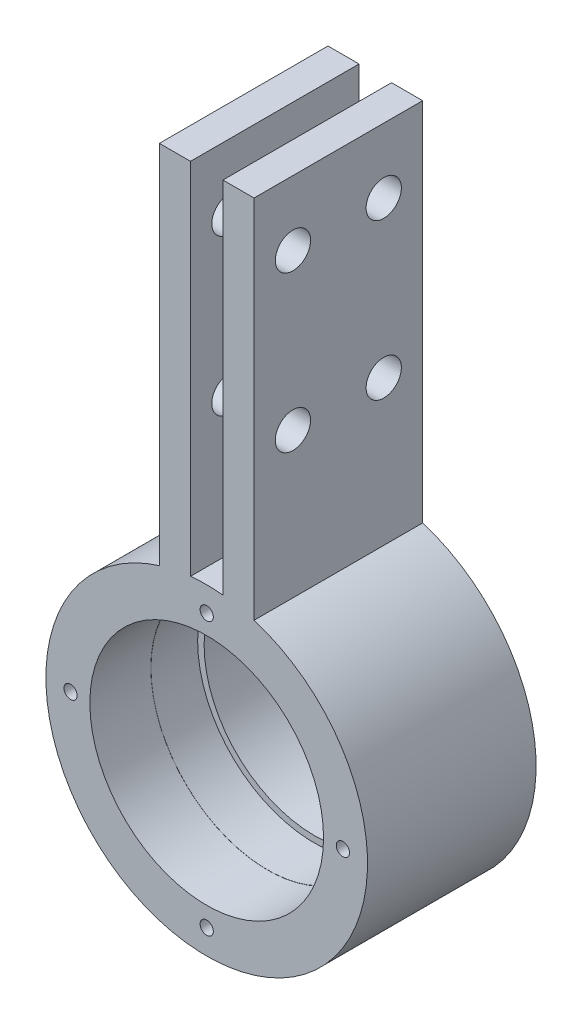
ISO-10303-21;
HEADER;
FILE_DESCRIPTION(('STEP AP214'),'2;1');
FILE_NAME('part.step','',(''),(''),'','','');
FILE_SCHEMA(('AUTOMOTIVE_DESIGN { 1 0 10303 214 1 1 1 1 }'));
ENDSEC;
DATA;
#1=APPLICATION_CONTEXT('core data for automotive mechanical design processes');
#2=APPLICATION_PROTOCOL_DEFINITION('international standard','automotive_design',2000,#1);
#3=PRODUCT_CONTEXT('',#1,'mechanical');
#4=PRODUCT('Part','Part','',(#3));
#5=PRODUCT_RELATED_PRODUCT_CATEGORY('part','',(#4));
#6=PRODUCT_DEFINITION_FORMATION('','',#4);
#7=PRODUCT_DEFINITION_CONTEXT('part definition',#1,'design');
#8=PRODUCT_DEFINITION('design','',#6,#7);
#9=PRODUCT_DEFINITION_SHAPE('','',#8);
#10=(LENGTH_UNIT() NAMED_UNIT(*) SI_UNIT(.MILLI.,.METRE.));
#11=(NAMED_UNIT(*) PLANE_ANGLE_UNIT() SI_UNIT($,.RADIAN.));
#12=(NAMED_UNIT(*) SI_UNIT($,.STERADIAN.) SOLID_ANGLE_UNIT());
#13=UNCERTAINTY_MEASURE_WITH_UNIT(LENGTH_MEASURE(1.E-05),#10,'distance_accuracy_value','');
#14=(GEOMETRIC_REPRESENTATION_CONTEXT(3) GLOBAL_UNCERTAINTY_ASSIGNED_CONTEXT((#13)) GLOBAL_UNIT_ASSIGNED_CONTEXT((#10,
#11,#12)) REPRESENTATION_CONTEXT('',''));
#15=CARTESIAN_POINT('',(0.,0.,0.));
#16=DIRECTION('',(0.,0.,1.));
#17=DIRECTION('',(1.,0.,0.));
#18=AXIS2_PLACEMENT_3D('',#15,#16,#17);
#19=CARTESIAN_POINT('',(0.,0.,65.));
#20=DIRECTION('',(0.,0.,-1.));
#21=DIRECTION('',(-1.,0.,0.));
#22=AXIS2_PLACEMENT_3D('',#19,#20,#21);
#23=CYLINDRICAL_SURFACE('',#22,42.5);
#24=CARTESIAN_POINT('',(0.,0.,0.));
#25=DIRECTION('',(0.,0.,1.));
#26=DIRECTION('',(1.,0.,0.));
#27=AXIS2_PLACEMENT_3D('',#24,#25,#26);
#28=CIRCLE('',#27,42.5);
#29=CARTESIAN_POINT('',(42.5,0.,0.));
#30=VERTEX_POINT('',#29);
#31=EDGE_CURVE('E151',#30,#30,#28,.T.);
#32=ORIENTED_EDGE('',*,*,#31,.F.);
#33=EDGE_LOOP('',(#32));
#34=FACE_BOUND('',#33,.T.);
#35=CARTESIAN_POINT('',(0.,0.,23.5));
#36=DIRECTION('',(0.,0.,1.));
#37=DIRECTION('',(1.,0.,0.));
#38=AXIS2_PLACEMENT_3D('',#35,#36,#37);
#39=CIRCLE('',#38,42.5);
#40=CARTESIAN_POINT('',(42.5,0.,23.5));
#41=VERTEX_POINT('',#40);
#42=EDGE_CURVE('E48',#41,#41,#39,.T.);
#43=ORIENTED_EDGE('',*,*,#42,.T.);
#44=EDGE_LOOP('',(#43));
#45=FACE_BOUND('',#44,.T.);
#46=ADVANCED_FACE('F45',(#34,#45),#23,.F.);
#47=CARTESIAN_POINT('',(6.25000000000002,0.,65.));
#48=DIRECTION('',(1.,0.,0.));
#49=DIRECTION('',(0.,1.,0.));
#50=AXIS2_PLACEMENT_3D('',#47,#48,#49);
#51=PLANE('',#50);
#52=CARTESIAN_POINT('',(6.24999999999999,175.253164472457,50.));
#53=DIRECTION('',(1.,0.,0.));
#54=DIRECTION('',(0.,1.,0.));
#55=AXIS2_PLACEMENT_3D('',#52,#53,#54);
#56=CIRCLE('',#55,6.8);
#57=CARTESIAN_POINT('',(6.24999999999999,182.053164472457,50.));
#58=VERTEX_POINT('',#57);
#59=EDGE_CURVE('E395',#58,#58,#56,.T.);
#60=ORIENTED_EDGE('',*,*,#59,.T.);
#61=EDGE_LOOP('',(#60));
#62=FACE_BOUND('',#61,.T.);
#63=CARTESIAN_POINT('',(6.24999999999999,175.253164472457,15.));
#64=DIRECTION('',(1.,0.,0.));
#65=DIRECTION('',(0.,1.,0.));
#66=AXIS2_PLACEMENT_3D('',#63,#64,#65);
#67=CIRCLE('',#66,6.8);
#68=CARTESIAN_POINT('',(6.24999999999999,182.053164472457,15.));
#69=VERTEX_POINT('',#68);
#70=EDGE_CURVE('E415',#69,#69,#67,.T.);
#71=ORIENTED_EDGE('',*,*,#70,.T.);
#72=EDGE_LOOP('',(#71));
#73=FACE_BOUND('',#72,.T.);
#74=CARTESIAN_POINT('',(6.25,115.253164472457,15.));
#75=DIRECTION('',(1.,0.,0.));
#76=DIRECTION('',(0.,1.,0.));
#77=AXIS2_PLACEMENT_3D('',#74,#75,#76);
#78=CIRCLE('',#77,6.79999999999999);
#79=CARTESIAN_POINT('',(6.25,122.053164472457,15.));
#80=VERTEX_POINT('',#79);
#81=EDGE_CURVE('E431',#80,#80,#78,.T.);
#82=ORIENTED_EDGE('',*,*,#81,.T.);
#83=EDGE_LOOP('',(#82));
#84=FACE_BOUND('',#83,.T.);
#85=CARTESIAN_POINT('',(6.25,115.253164472457,50.));
#86=DIRECTION('',(1.,0.,0.));
#87=DIRECTION('',(0.,1.,0.));
#88=AXIS2_PLACEMENT_3D('',#85,#86,#87);
#89=CIRCLE('',#88,6.79999999999999);
#90=CARTESIAN_POINT('',(6.25,122.053164472457,50.));
#91=VERTEX_POINT('',#90);
#92=EDGE_CURVE('E447',#91,#91,#89,.T.);
#93=ORIENTED_EDGE('',*,*,#92,.T.);
#94=EDGE_LOOP('',(#93));
#95=FACE_BOUND('',#94,.T.);
#96=DIRECTION('',(0.,-1.,0.));
#97=VECTOR('',#96,1.);
#98=CARTESIAN_POINT('',(6.25000000000002,0.,0.));
#99=LINE('',#98,#97);
#100=CARTESIAN_POINT('',(6.24999999999999,200.253164472457,0.));
#101=VERTEX_POINT('',#100);
#102=CARTESIAN_POINT('',(6.25000000000001,61.6841754423289,0.));
#103=VERTEX_POINT('',#102);
#104=EDGE_CURVE('E155',#101,#103,#99,.T.);
#105=ORIENTED_EDGE('',*,*,#104,.T.);
#106=DIRECTION('',(0.,0.,-1.));
#107=VECTOR('',#106,1.);
#108=CARTESIAN_POINT('',(6.25000000000001,61.6841754423289,65.));
#109=LINE('',#108,#107);
#110=CARTESIAN_POINT('',(6.25000000000001,61.6841754423289,65.));
#111=VERTEX_POINT('',#110);
#112=EDGE_CURVE('E11',#111,#103,#109,.T.);
#113=ORIENTED_EDGE('',*,*,#112,.F.);
#114=DIRECTION('',(0.,-1.,0.));
#115=VECTOR('',#114,1.);
#116=CARTESIAN_POINT('',(6.25000000000002,0.,65.));
#117=LINE('',#116,#115);
#118=CARTESIAN_POINT('',(6.24999999999999,200.253164472457,65.));
#119=VERTEX_POINT('',#118);
#120=EDGE_CURVE('E184',#119,#111,#117,.T.);
#121=ORIENTED_EDGE('',*,*,#120,.F.);
#122=DIRECTION('',(0.,0.,-1.));
#123=VECTOR('',#122,1.);
#124=CARTESIAN_POINT('',(6.24999999999999,200.253164472457,65.));
#125=LINE('',#124,#123);
#126=EDGE_CURVE('E63',#119,#101,#125,.T.);
#127=ORIENTED_EDGE('',*,*,#126,.T.);
#128=EDGE_LOOP('',(#105,#113,#121,#127));
#129=FACE_BOUND('',#128,.T.);
#130=ADVANCED_FACE('F237',(#62,#73,#84,#95,#129),#51,.F.);
#131=CARTESIAN_POINT('',(0.,0.,65.));
#132=DIRECTION('',(0.,0.,-1.));
#133=DIRECTION('',(-1.,0.,0.));
#134=AXIS2_PLACEMENT_3D('',#131,#132,#133);
#135=CYLINDRICAL_SURFACE('',#134,62.0000000000001);
#136=CARTESIAN_POINT('',(0.,0.,0.));
#137=DIRECTION('',(0.,0.,1.));
#138=DIRECTION('',(1.,0.,0.));
#139=AXIS2_PLACEMENT_3D('',#136,#137,#138);
#140=CIRCLE('',#139,62.0000000000001);
#141=CARTESIAN_POINT('',(-6.24999999999999,61.6841754423289,0.));
#142=VERTEX_POINT('',#141);
#143=EDGE_CURVE('E159',#103,#142,#140,.T.);
#144=ORIENTED_EDGE('',*,*,#143,.T.);
#145=DIRECTION('',(0.,0.,-1.));
#146=VECTOR('',#145,1.);
#147=CARTESIAN_POINT('',(-6.24999999999999,61.6841754423289,65.));
#148=LINE('',#147,#146);
#149=CARTESIAN_POINT('',(-6.24999999999999,61.6841754423289,65.));
#150=VERTEX_POINT('',#149);
#151=EDGE_CURVE('E55',#150,#142,#148,.T.);
#152=ORIENTED_EDGE('',*,*,#151,.F.);
#153=CARTESIAN_POINT('',(0.,0.,65.));
#154=DIRECTION('',(0.,0.,1.));
#155=DIRECTION('',(1.,0.,0.));
#156=AXIS2_PLACEMENT_3D('',#153,#154,#155);
#157=CIRCLE('',#156,62.0000000000001);
#158=EDGE_CURVE('E103',#111,#150,#157,.T.);
#159=ORIENTED_EDGE('',*,*,#158,.F.);
#160=ORIENTED_EDGE('',*,*,#112,.T.);
#161=EDGE_LOOP('',(#144,#152,#159,#160));
#162=FACE_BOUND('',#161,.T.);
#163=ADVANCED_FACE('F204',(#162),#135,.T.);
#164=CARTESIAN_POINT('',(-6.24999999999998,0.,65.));
#165=DIRECTION('',(1.,0.,0.));
#166=DIRECTION('',(0.,1.,0.));
#167=AXIS2_PLACEMENT_3D('',#164,#165,#166);
#168=PLANE('',#167);
#169=CARTESIAN_POINT('',(-6.25000000000001,175.253164472457,50.));
#170=DIRECTION('',(1.,0.,0.));
#171=DIRECTION('',(0.,1.,0.));
#172=AXIS2_PLACEMENT_3D('',#169,#170,#171);
#173=CIRCLE('',#172,6.8);
#174=CARTESIAN_POINT('',(-6.25000000000001,182.053164472457,50.));
#175=VERTEX_POINT('',#174);
#176=EDGE_CURVE('E388',#175,#175,#173,.T.);
#177=ORIENTED_EDGE('',*,*,#176,.F.);
#178=EDGE_LOOP('',(#177));
#179=FACE_BOUND('',#178,.T.);
#180=CARTESIAN_POINT('',(-6.25000000000001,175.253164472457,15.));
#181=DIRECTION('',(1.,0.,0.));
#182=DIRECTION('',(0.,1.,0.));
#183=AXIS2_PLACEMENT_3D('',#180,#181,#182);
#184=CIRCLE('',#183,6.8);
#185=CARTESIAN_POINT('',(-6.25000000000001,182.053164472457,15.));
#186=VERTEX_POINT('',#185);
#187=EDGE_CURVE('E411',#186,#186,#184,.T.);
#188=ORIENTED_EDGE('',*,*,#187,.F.);
#189=EDGE_LOOP('',(#188));
#190=FACE_BOUND('',#189,.T.);
#191=CARTESIAN_POINT('',(-6.25,115.253164472457,15.));
#192=DIRECTION('',(1.,0.,0.));
#193=DIRECTION('',(0.,1.,0.));
#194=AXIS2_PLACEMENT_3D('',#191,#192,#193);
#195=CIRCLE('',#194,6.79999999999999);
#196=CARTESIAN_POINT('',(-6.25,122.053164472457,15.));
#197=VERTEX_POINT('',#196);
#198=EDGE_CURVE('E423',#197,#197,#195,.T.);
#199=ORIENTED_EDGE('',*,*,#198,.F.);
#200=EDGE_LOOP('',(#199));
#201=FACE_BOUND('',#200,.T.);
#202=CARTESIAN_POINT('',(-6.25,115.253164472457,50.));
#203=DIRECTION('',(1.,0.,0.));
#204=DIRECTION('',(0.,1.,0.));
#205=AXIS2_PLACEMENT_3D('',#202,#203,#204);
#206=CIRCLE('',#205,6.79999999999999);
#207=CARTESIAN_POINT('',(-6.25,122.053164472457,50.));
#208=VERTEX_POINT('',#207);
#209=EDGE_CURVE('E443',#208,#208,#206,.T.);
#210=ORIENTED_EDGE('',*,*,#209,.F.);
#211=EDGE_LOOP('',(#210));
#212=FACE_BOUND('',#211,.T.);
#213=DIRECTION('',(0.,-1.,0.));
#214=VECTOR('',#213,1.);
#215=CARTESIAN_POINT('',(-6.24999999999998,0.,0.));
#216=LINE('',#215,#214);
#217=CARTESIAN_POINT('',(-6.25000000000001,200.253164472457,0.));
#218=VERTEX_POINT('',#217);
#219=EDGE_CURVE('E163',#218,#142,#216,.T.);
#220=ORIENTED_EDGE('',*,*,#219,.F.);
#221=DIRECTION('',(0.,0.,-1.));
#222=VECTOR('',#221,1.);
#223=CARTESIAN_POINT('',(-6.25000000000001,200.253164472457,65.));
#224=LINE('',#223,#222);
#225=CARTESIAN_POINT('',(-6.25000000000001,200.253164472457,65.));
#226=VERTEX_POINT('',#225);
#227=EDGE_CURVE('E194',#226,#218,#224,.T.);
#228=ORIENTED_EDGE('',*,*,#227,.F.);
#229=DIRECTION('',(0.,-1.,0.));
#230=VECTOR('',#229,1.);
#231=CARTESIAN_POINT('',(-6.24999999999998,0.,65.));
#232=LINE('',#231,#230);
#233=EDGE_CURVE('E203',#226,#150,#232,.T.);
#234=ORIENTED_EDGE('',*,*,#233,.T.);
#235=ORIENTED_EDGE('',*,*,#151,.T.);
#236=EDGE_LOOP('',(#220,#228,#234,#235));
#237=FACE_BOUND('',#236,.T.);
#238=ADVANCED_FACE('F201',(#179,#190,#201,#212,#237),#168,.T.);
#239=CARTESIAN_POINT('',(0.,200.253164472457,65.));
#240=DIRECTION('',(0.,1.,0.));
#241=DIRECTION('',(0.,0.,1.));
#242=AXIS2_PLACEMENT_3D('',#239,#240,#241);
#243=PLANE('',#242);
#244=DIRECTION('',(1.,0.,0.));
#245=VECTOR('',#244,1.);
#246=CARTESIAN_POINT('',(0.,200.253164472457,0.));
#247=LINE('',#246,#245);
#248=CARTESIAN_POINT('',(-18.25,200.253164472457,0.));
#249=VERTEX_POINT('',#248);
#250=EDGE_CURVE('E167',#249,#218,#247,.T.);
#251=ORIENTED_EDGE('',*,*,#250,.F.);
#252=DIRECTION('',(0.,0.,-1.));
#253=VECTOR('',#252,1.);
#254=CARTESIAN_POINT('',(-18.25,200.253164472457,65.));
#255=LINE('',#254,#253);
#256=CARTESIAN_POINT('',(-18.25,200.253164472457,65.));
#257=VERTEX_POINT('',#256);
#258=EDGE_CURVE('E191',#257,#249,#255,.T.);
#259=ORIENTED_EDGE('',*,*,#258,.F.);
#260=DIRECTION('',(1.,0.,0.));
#261=VECTOR('',#260,1.);
#262=CARTESIAN_POINT('',(0.,200.253164472457,65.));
#263=LINE('',#262,#261);
#264=EDGE_CURVE('E213',#257,#226,#263,.T.);
#265=ORIENTED_EDGE('',*,*,#264,.T.);
#266=ORIENTED_EDGE('',*,*,#227,.T.);
#267=EDGE_LOOP('',(#251,#259,#265,#266));
#268=FACE_BOUND('',#267,.T.);
#269=ADVANCED_FACE('F211',(#268),#243,.T.);
#270=CARTESIAN_POINT('',(-18.25,0.,65.));
#271=DIRECTION('',(-1.,0.,0.));
#272=DIRECTION('',(0.,-1.,0.));
#273=AXIS2_PLACEMENT_3D('',#270,#271,#272);
#274=PLANE('',#273);
#275=CARTESIAN_POINT('',(-18.25,175.253164472457,50.));
#276=DIRECTION('',(-1.,0.,0.));
#277=DIRECTION('',(0.,-1.,0.));
#278=AXIS2_PLACEMENT_3D('',#275,#276,#277);
#279=CIRCLE('',#278,6.8);
#280=CARTESIAN_POINT('',(-18.25,168.453164472457,50.));
#281=VERTEX_POINT('',#280);
#282=EDGE_CURVE('E385',#281,#281,#279,.T.);
#283=ORIENTED_EDGE('',*,*,#282,.F.);
#284=EDGE_LOOP('',(#283));
#285=FACE_BOUND('',#284,.T.);
#286=CARTESIAN_POINT('',(-18.25,175.253164472457,15.));
#287=DIRECTION('',(-1.,0.,0.));
#288=DIRECTION('',(0.,-1.,0.));
#289=AXIS2_PLACEMENT_3D('',#286,#287,#288);
#290=CIRCLE('',#289,6.8);
#291=CARTESIAN_POINT('',(-18.25,168.453164472457,15.));
#292=VERTEX_POINT('',#291);
#293=EDGE_CURVE('E407',#292,#292,#290,.T.);
#294=ORIENTED_EDGE('',*,*,#293,.F.);
#295=EDGE_LOOP('',(#294));
#296=FACE_BOUND('',#295,.T.);
#297=CARTESIAN_POINT('',(-18.25,115.253164472457,15.));
#298=DIRECTION('',(-1.,0.,0.));
#299=DIRECTION('',(0.,-1.,0.));
#300=AXIS2_PLACEMENT_3D('',#297,#298,#299);
#301=CIRCLE('',#300,6.79999999999999);
#302=CARTESIAN_POINT('',(-18.25,108.453164472457,15.));
#303=VERTEX_POINT('',#302);
#304=EDGE_CURVE('E427',#303,#303,#301,.T.);
#305=ORIENTED_EDGE('',*,*,#304,.F.);
#306=EDGE_LOOP('',(#305));
#307=FACE_BOUND('',#306,.T.);
#308=CARTESIAN_POINT('',(-18.25,115.253164472457,50.));
#309=DIRECTION('',(-1.,0.,0.));
#310=DIRECTION('',(0.,-1.,0.));
#311=AXIS2_PLACEMENT_3D('',#308,#309,#310);
#312=CIRCLE('',#311,6.79999999999999);
#313=CARTESIAN_POINT('',(-18.25,108.453164472457,50.));
#314=VERTEX_POINT('',#313);
#315=EDGE_CURVE('E439',#314,#314,#312,.T.);
#316=ORIENTED_EDGE('',*,*,#315,.F.);
#317=EDGE_LOOP('',(#316));
#318=FACE_BOUND('',#317,.T.);
#319=DIRECTION('',(0.,1.,0.));
#320=VECTOR('',#319,1.);
#321=CARTESIAN_POINT('',(-18.25,0.,0.));
#322=LINE('',#321,#320);
#323=CARTESIAN_POINT('',(-18.25,59.2531644724568,0.));
#324=VERTEX_POINT('',#323);
#325=EDGE_CURVE('E171',#324,#249,#322,.T.);
#326=ORIENTED_EDGE('',*,*,#325,.F.);
#327=DIRECTION('',(0.,0.,-1.));
#328=VECTOR('',#327,1.);
#329=CARTESIAN_POINT('',(-18.25,59.2531644724568,65.));
#330=LINE('',#329,#328);
#331=CARTESIAN_POINT('',(-18.25,59.2531644724568,65.));
#332=VERTEX_POINT('',#331);
#333=EDGE_CURVE('E141',#332,#324,#330,.T.);
#334=ORIENTED_EDGE('',*,*,#333,.F.);
#335=DIRECTION('',(0.,1.,0.));
#336=VECTOR('',#335,1.);
#337=CARTESIAN_POINT('',(-18.25,0.,65.));
#338=LINE('',#337,#336);
#339=EDGE_CURVE('E129',#332,#257,#338,.T.);
#340=ORIENTED_EDGE('',*,*,#339,.T.);
#341=ORIENTED_EDGE('',*,*,#258,.T.);
#342=EDGE_LOOP('',(#326,#334,#340,#341));
#343=FACE_BOUND('',#342,.T.);
#344=ADVANCED_FACE('F223',(#285,#296,#307,#318,#343),#274,.T.);
#345=CARTESIAN_POINT('',(0.,0.,65.));
#346=DIRECTION('',(0.,0.,-1.));
#347=DIRECTION('',(-1.,0.,0.));
#348=AXIS2_PLACEMENT_3D('',#345,#346,#347);
#349=CYLINDRICAL_SURFACE('',#348,62.0000000000001);
#350=CARTESIAN_POINT('',(0.,0.,0.));
#351=DIRECTION('',(0.,0.,1.));
#352=DIRECTION('',(1.,0.,0.));
#353=AXIS2_PLACEMENT_3D('',#350,#351,#352);
#354=CIRCLE('',#353,62.0000000000001);
#355=CARTESIAN_POINT('',(18.25,59.2531644724568,0.));
#356=VERTEX_POINT('',#355);
#357=EDGE_CURVE('E137',#324,#356,#354,.T.);
#358=ORIENTED_EDGE('',*,*,#357,.T.);
#359=DIRECTION('',(0.,0.,-1.));
#360=VECTOR('',#359,1.);
#361=CARTESIAN_POINT('',(18.25,59.2531644724568,65.));
#362=LINE('',#361,#360);
#363=CARTESIAN_POINT('',(18.25,59.2531644724568,65.));
#364=VERTEX_POINT('',#363);
#365=EDGE_CURVE('E134',#364,#356,#362,.T.);
#366=ORIENTED_EDGE('',*,*,#365,.F.);
#367=CARTESIAN_POINT('',(0.,0.,65.));
#368=DIRECTION('',(0.,0.,1.));
#369=DIRECTION('',(1.,0.,0.));
#370=AXIS2_PLACEMENT_3D('',#367,#368,#369);
#371=CIRCLE('',#370,62.0000000000001);
#372=EDGE_CURVE('E121',#332,#364,#371,.T.);
#373=ORIENTED_EDGE('',*,*,#372,.F.);
#374=ORIENTED_EDGE('',*,*,#333,.T.);
#375=EDGE_LOOP('',(#358,#366,#373,#374));
#376=FACE_BOUND('',#375,.T.);
#377=ADVANCED_FACE('F135',(#376),#349,.T.);
#378=CARTESIAN_POINT('',(18.25,0.,65.));
#379=DIRECTION('',(-1.,0.,0.));
#380=DIRECTION('',(0.,-1.,0.));
#381=AXIS2_PLACEMENT_3D('',#378,#379,#380);
#382=PLANE('',#381);
#383=CARTESIAN_POINT('',(18.25,175.253164472457,50.));
#384=DIRECTION('',(1.,0.,0.));
#385=DIRECTION('',(0.,0.,-1.));
#386=AXIS2_PLACEMENT_3D('',#383,#384,#385);
#387=CIRCLE('',#386,6.8);
#388=CARTESIAN_POINT('',(18.25,175.253164472457,43.2));
#389=VERTEX_POINT('',#388);
#390=EDGE_CURVE('E391',#389,#389,#387,.T.);
#391=ORIENTED_EDGE('',*,*,#390,.F.);
#392=EDGE_LOOP('',(#391));
#393=FACE_BOUND('',#392,.T.);
#394=CARTESIAN_POINT('',(18.25,175.253164472457,15.));
#395=DIRECTION('',(1.,0.,0.));
#396=DIRECTION('',(0.,0.,-1.));
#397=AXIS2_PLACEMENT_3D('',#394,#395,#396);
#398=CIRCLE('',#397,6.8);
#399=CARTESIAN_POINT('',(18.25,175.253164472457,8.2));
#400=VERTEX_POINT('',#399);
#401=EDGE_CURVE('E403',#400,#400,#398,.T.);
#402=ORIENTED_EDGE('',*,*,#401,.F.);
#403=EDGE_LOOP('',(#402));
#404=FACE_BOUND('',#403,.T.);
#405=CARTESIAN_POINT('',(18.25,115.253164472457,15.));
#406=DIRECTION('',(1.,0.,0.));
#407=DIRECTION('',(0.,0.,-1.));
#408=AXIS2_PLACEMENT_3D('',#405,#406,#407);
#409=CIRCLE('',#408,6.79999999999999);
#410=CARTESIAN_POINT('',(18.25,115.253164472457,8.20000000000001));
#411=VERTEX_POINT('',#410);
#412=EDGE_CURVE('E419',#411,#411,#409,.T.);
#413=ORIENTED_EDGE('',*,*,#412,.F.);
#414=EDGE_LOOP('',(#413));
#415=FACE_BOUND('',#414,.T.);
#416=CARTESIAN_POINT('',(18.25,115.253164472457,50.));
#417=DIRECTION('',(1.,0.,0.));
#418=DIRECTION('',(0.,0.,-1.));
#419=AXIS2_PLACEMENT_3D('',#416,#417,#418);
#420=CIRCLE('',#419,6.79999999999999);
#421=CARTESIAN_POINT('',(18.25,115.253164472457,43.2));
#422=VERTEX_POINT('',#421);
#423=EDGE_CURVE('E435',#422,#422,#420,.T.);
#424=ORIENTED_EDGE('',*,*,#423,.F.);
#425=EDGE_LOOP('',(#424));
#426=FACE_BOUND('',#425,.T.);
#427=DIRECTION('',(0.,1.,0.));
#428=VECTOR('',#427,1.);
#429=CARTESIAN_POINT('',(18.25,0.,0.));
#430=LINE('',#429,#428);
#431=CARTESIAN_POINT('',(18.25,200.253164472457,0.));
#432=VERTEX_POINT('',#431);
#433=EDGE_CURVE('E177',#356,#432,#430,.T.);
#434=ORIENTED_EDGE('',*,*,#433,.T.);
#435=DIRECTION('',(0.,0.,-1.));
#436=VECTOR('',#435,1.);
#437=CARTESIAN_POINT('',(18.25,200.253164472457,65.));
#438=LINE('',#437,#436);
#439=CARTESIAN_POINT('',(18.25,200.253164472457,65.));
#440=VERTEX_POINT('',#439);
#441=EDGE_CURVE('E91',#440,#432,#438,.T.);
#442=ORIENTED_EDGE('',*,*,#441,.F.);
#443=DIRECTION('',(0.,1.,0.));
#444=VECTOR('',#443,1.);
#445=CARTESIAN_POINT('',(18.25,0.,65.));
#446=LINE('',#445,#444);
#447=EDGE_CURVE('E126',#364,#440,#446,.T.);
#448=ORIENTED_EDGE('',*,*,#447,.F.);
#449=ORIENTED_EDGE('',*,*,#365,.T.);
#450=EDGE_LOOP('',(#434,#442,#448,#449));
#451=FACE_BOUND('',#450,.T.);
#452=ADVANCED_FACE('F143',(#393,#404,#415,#426,#451),#382,.F.);
#453=CARTESIAN_POINT('',(0.,200.253164472457,65.));
#454=DIRECTION('',(0.,1.,0.));
#455=DIRECTION('',(0.,0.,1.));
#456=AXIS2_PLACEMENT_3D('',#453,#454,#455);
#457=PLANE('',#456);
#458=DIRECTION('',(1.,0.,0.));
#459=VECTOR('',#458,1.);
#460=CARTESIAN_POINT('',(0.,200.253164472457,0.));
#461=LINE('',#460,#459);
#462=EDGE_CURVE('E180',#101,#432,#461,.T.);
#463=ORIENTED_EDGE('',*,*,#462,.F.);
#464=ORIENTED_EDGE('',*,*,#126,.F.);
#465=DIRECTION('',(1.,0.,0.));
#466=VECTOR('',#465,1.);
#467=CARTESIAN_POINT('',(0.,200.253164472457,65.));
#468=LINE('',#467,#466);
#469=EDGE_CURVE('E145',#119,#440,#468,.T.);
#470=ORIENTED_EDGE('',*,*,#469,.T.);
#471=ORIENTED_EDGE('',*,*,#441,.T.);
#472=EDGE_LOOP('',(#463,#464,#470,#471));
#473=FACE_BOUND('',#472,.T.);
#474=ADVANCED_FACE('F224',(#473),#457,.T.);
#475=CARTESIAN_POINT('',(0.,0.,65.));
#476=DIRECTION('',(0.,0.,1.));
#477=DIRECTION('',(1.,0.,0.));
#478=AXIS2_PLACEMENT_3D('',#475,#476,#477);
#479=PLANE('',#478);
#480=CARTESIAN_POINT('',(-52.5,0.,65.));
#481=DIRECTION('',(0.,0.,1.));
#482=DIRECTION('',(1.,0.,0.));
#483=AXIS2_PLACEMENT_3D('',#480,#481,#482);
#484=CIRCLE('',#483,2.54999999999999);
#485=CARTESIAN_POINT('',(-49.95,0.,65.));
#486=VERTEX_POINT('',#485);
#487=EDGE_CURVE('E483',#486,#486,#484,.T.);
#488=ORIENTED_EDGE('',*,*,#487,.F.);
#489=EDGE_LOOP('',(#488));
#490=FACE_BOUND('',#489,.T.);
#491=CARTESIAN_POINT('',(0.,52.5,65.));
#492=DIRECTION('',(0.,0.,1.));
#493=DIRECTION('',(1.,0.,0.));
#494=AXIS2_PLACEMENT_3D('',#491,#492,#493);
#495=CIRCLE('',#494,2.54999999999999);
#496=CARTESIAN_POINT('',(2.54999999999999,52.5,65.));
#497=VERTEX_POINT('',#496);
#498=EDGE_CURVE('E491',#497,#497,#495,.T.);
#499=ORIENTED_EDGE('',*,*,#498,.F.);
#500=EDGE_LOOP('',(#499));
#501=FACE_BOUND('',#500,.T.);
#502=CARTESIAN_POINT('',(52.5,0.,65.));
#503=DIRECTION('',(0.,0.,1.));
#504=DIRECTION('',(1.,0.,0.));
#505=AXIS2_PLACEMENT_3D('',#502,#503,#504);
#506=CIRCLE('',#505,2.54999999999999);
#507=CARTESIAN_POINT('',(55.05,0.,65.));
#508=VERTEX_POINT('',#507);
#509=EDGE_CURVE('E499',#508,#508,#506,.T.);
#510=ORIENTED_EDGE('',*,*,#509,.F.);
#511=EDGE_LOOP('',(#510));
#512=FACE_BOUND('',#511,.T.);
#513=CARTESIAN_POINT('',(0.,-52.5,65.));
#514=DIRECTION('',(0.,0.,1.));
#515=DIRECTION('',(1.,0.,0.));
#516=AXIS2_PLACEMENT_3D('',#513,#514,#515);
#517=CIRCLE('',#516,2.54999999999999);
#518=CARTESIAN_POINT('',(2.54999999999999,-52.5,65.));
#519=VERTEX_POINT('',#518);
#520=EDGE_CURVE('E506',#519,#519,#517,.T.);
#521=ORIENTED_EDGE('',*,*,#520,.F.);
#522=EDGE_LOOP('',(#521));
#523=FACE_BOUND('',#522,.T.);
#524=CARTESIAN_POINT('',(0.,0.,65.));
#525=DIRECTION('',(0.,0.,1.));
#526=DIRECTION('',(1.,0.,0.));
#527=AXIS2_PLACEMENT_3D('',#524,#525,#526);
#528=CIRCLE('',#527,45.05);
#529=CARTESIAN_POINT('',(45.05,0.,65.));
#530=VERTEX_POINT('',#529);
#531=EDGE_CURVE('E249',#530,#530,#528,.T.);
#532=ORIENTED_EDGE('',*,*,#531,.F.);
#533=EDGE_LOOP('',(#532));
#534=FACE_BOUND('',#533,.T.);
#535=ORIENTED_EDGE('',*,*,#120,.T.);
#536=ORIENTED_EDGE('',*,*,#158,.T.);
#537=ORIENTED_EDGE('',*,*,#233,.F.);
#538=ORIENTED_EDGE('',*,*,#264,.F.);
#539=ORIENTED_EDGE('',*,*,#339,.F.);
#540=ORIENTED_EDGE('',*,*,#372,.T.);
#541=ORIENTED_EDGE('',*,*,#447,.T.);
#542=ORIENTED_EDGE('',*,*,#469,.F.);
#543=EDGE_LOOP('',(#535,#536,#537,#538,#539,#540,#541,#542));
#544=FACE_BOUND('',#543,.T.);
#545=ADVANCED_FACE('F123',(#490,#501,#512,#523,#534,#544),#479,.T.);
#546=CARTESIAN_POINT('',(0.,0.,0.));
#547=DIRECTION('',(0.,0.,1.));
#548=DIRECTION('',(1.,0.,0.));
#549=AXIS2_PLACEMENT_3D('',#546,#547,#548);
#550=PLANE('',#549);
#551=CARTESIAN_POINT('',(0.,52.5,0.));
#552=DIRECTION('',(0.,0.,-1.));
#553=DIRECTION('',(-1.,0.,0.));
#554=AXIS2_PLACEMENT_3D('',#551,#552,#553);
#555=CIRCLE('',#554,2.54999999999999);
#556=CARTESIAN_POINT('',(-2.54999999999999,52.5,0.));
#557=VERTEX_POINT('',#556);
#558=EDGE_CURVE('E451',#557,#557,#555,.T.);
#559=ORIENTED_EDGE('',*,*,#558,.F.);
#560=EDGE_LOOP('',(#559));
#561=FACE_BOUND('',#560,.T.);
#562=CARTESIAN_POINT('',(-52.5,0.,0.));
#563=DIRECTION('',(0.,0.,-1.));
#564=DIRECTION('',(-1.,0.,0.));
#565=AXIS2_PLACEMENT_3D('',#562,#563,#564);
#566=CIRCLE('',#565,2.54999999999999);
#567=CARTESIAN_POINT('',(-55.05,0.,0.));
#568=VERTEX_POINT('',#567);
#569=EDGE_CURVE('E459',#568,#568,#566,.T.);
#570=ORIENTED_EDGE('',*,*,#569,.F.);
#571=EDGE_LOOP('',(#570));
#572=FACE_BOUND('',#571,.T.);
#573=CARTESIAN_POINT('',(0.,-52.5,0.));
#574=DIRECTION('',(0.,0.,-1.));
#575=DIRECTION('',(-1.,0.,0.));
#576=AXIS2_PLACEMENT_3D('',#573,#574,#575);
#577=CIRCLE('',#576,2.54999999999999);
#578=CARTESIAN_POINT('',(-2.54999999999999,-52.5,0.));
#579=VERTEX_POINT('',#578);
#580=EDGE_CURVE('E467',#579,#579,#577,.T.);
#581=ORIENTED_EDGE('',*,*,#580,.F.);
#582=EDGE_LOOP('',(#581));
#583=FACE_BOUND('',#582,.T.);
#584=CARTESIAN_POINT('',(52.5,0.,0.));
#585=DIRECTION('',(0.,0.,-1.));
#586=DIRECTION('',(-1.,0.,0.));
#587=AXIS2_PLACEMENT_3D('',#584,#585,#586);
#588=CIRCLE('',#587,2.54999999999999);
#589=CARTESIAN_POINT('',(49.95,0.,0.));
#590=VERTEX_POINT('',#589);
#591=EDGE_CURVE('E475',#590,#590,#588,.T.);
#592=ORIENTED_EDGE('',*,*,#591,.F.);
#593=EDGE_LOOP('',(#592));
#594=FACE_BOUND('',#593,.T.);
#595=ORIENTED_EDGE('',*,*,#31,.T.);
#596=EDGE_LOOP('',(#595));
#597=FACE_BOUND('',#596,.T.);
#598=ORIENTED_EDGE('',*,*,#104,.F.);
#599=ORIENTED_EDGE('',*,*,#462,.T.);
#600=ORIENTED_EDGE('',*,*,#433,.F.);
#601=ORIENTED_EDGE('',*,*,#357,.F.);
#602=ORIENTED_EDGE('',*,*,#325,.T.);
#603=ORIENTED_EDGE('',*,*,#250,.T.);
#604=ORIENTED_EDGE('',*,*,#219,.T.);
#605=ORIENTED_EDGE('',*,*,#143,.F.);
#606=EDGE_LOOP('',(#598,#599,#600,#601,#602,#603,#604,#605));
#607=FACE_BOUND('',#606,.T.);
#608=ADVANCED_FACE('F207',(#561,#572,#583,#594,#597,#607),#550,.F.);
#609=CARTESIAN_POINT('',(0.,0.,41.5));
#610=DIRECTION('',(0.,0.,1.));
#611=DIRECTION('',(1.,0.,0.));
#612=AXIS2_PLACEMENT_3D('',#609,#610,#611);
#613=CYLINDRICAL_SURFACE('',#612,45.05);
#614=CARTESIAN_POINT('',(0.,0.,41.5));
#615=DIRECTION('',(0.,0.,1.));
#616=DIRECTION('',(1.,0.,0.));
#617=AXIS2_PLACEMENT_3D('',#614,#615,#616);
#618=CIRCLE('',#617,45.05);
#619=CARTESIAN_POINT('',(45.05,0.,41.5));
#620=VERTEX_POINT('',#619);
#621=EDGE_CURVE('E156',#620,#620,#618,.T.);
#622=ORIENTED_EDGE('',*,*,#621,.F.);
#623=EDGE_LOOP('',(#622));
#624=FACE_BOUND('',#623,.T.);
#625=ORIENTED_EDGE('',*,*,#531,.T.);
#626=EDGE_LOOP('',(#625));
#627=FACE_BOUND('',#626,.T.);
#628=ADVANCED_FACE('F274',(#624,#627),#613,.F.);
#629=CARTESIAN_POINT('',(0.,0.,41.5));
#630=DIRECTION('',(0.,0.,1.));
#631=DIRECTION('',(1.,0.,0.));
#632=AXIS2_PLACEMENT_3D('',#629,#630,#631);
#633=PLANE('',#632);
#634=CARTESIAN_POINT('',(0.,0.,41.5));
#635=DIRECTION('',(0.,0.,1.));
#636=DIRECTION('',(1.,0.,0.));
#637=AXIS2_PLACEMENT_3D('',#634,#635,#636);
#638=CIRCLE('',#637,44.9925);
#639=CARTESIAN_POINT('',(44.9925,0.,41.5));
#640=VERTEX_POINT('',#639);
#641=EDGE_CURVE('E256',#640,#640,#638,.T.);
#642=ORIENTED_EDGE('',*,*,#641,.F.);
#643=EDGE_LOOP('',(#642));
#644=FACE_BOUND('',#643,.T.);
#645=ORIENTED_EDGE('',*,*,#621,.T.);
#646=EDGE_LOOP('',(#645));
#647=FACE_BOUND('',#646,.T.);
#648=ADVANCED_FACE('F272',(#644,#647),#633,.T.);
#649=CARTESIAN_POINT('',(0.,0.,23.5));
#650=DIRECTION('',(0.,0.,1.));
#651=DIRECTION('',(1.,0.,0.));
#652=AXIS2_PLACEMENT_3D('',#649,#650,#651);
#653=CYLINDRICAL_SURFACE('',#652,44.9925);
#654=CARTESIAN_POINT('',(0.,0.,23.5));
#655=DIRECTION('',(0.,0.,1.));
#656=DIRECTION('',(1.,0.,0.));
#657=AXIS2_PLACEMENT_3D('',#654,#655,#656);
#658=CIRCLE('',#657,44.9925);
#659=CARTESIAN_POINT('',(44.9925,0.,23.5));
#660=VERTEX_POINT('',#659);
#661=EDGE_CURVE('E250',#660,#660,#658,.T.);
#662=ORIENTED_EDGE('',*,*,#661,.F.);
#663=EDGE_LOOP('',(#662));
#664=FACE_BOUND('',#663,.T.);
#665=ORIENTED_EDGE('',*,*,#641,.T.);
#666=EDGE_LOOP('',(#665));
#667=FACE_BOUND('',#666,.T.);
#668=ADVANCED_FACE('F284',(#664,#667),#653,.F.);
#669=CARTESIAN_POINT('',(0.,0.,23.5));
#670=DIRECTION('',(0.,0.,1.));
#671=DIRECTION('',(1.,0.,0.));
#672=AXIS2_PLACEMENT_3D('',#669,#670,#671);
#673=PLANE('',#672);
#674=ORIENTED_EDGE('',*,*,#42,.F.);
#675=EDGE_LOOP('',(#674));
#676=FACE_BOUND('',#675,.T.);
#677=ORIENTED_EDGE('',*,*,#661,.T.);
#678=EDGE_LOOP('',(#677));
#679=FACE_BOUND('',#678,.T.);
#680=ADVANCED_FACE('F291',(#676,#679),#673,.T.);
#681=CARTESIAN_POINT('',(0.,-52.5,53.));
#682=DIRECTION('',(0.,0.,1.));
#683=DIRECTION('',(1.,0.,0.));
#684=AXIS2_PLACEMENT_3D('',#681,#682,#683);
#685=CONICAL_SURFACE('',#684,2.55,1.02974425867665);
#686=CARTESIAN_POINT('',(0.,-52.5,51.4678054214797));
#687=VERTEX_POINT('',#686);
#688=VERTEX_LOOP('',#687);
#689=FACE_BOUND('',#688,.T.);
#690=CARTESIAN_POINT('',(0.,-52.5,53.));
#691=DIRECTION('',(0.,0.,1.));
#692=DIRECTION('',(1.,0.,0.));
#693=AXIS2_PLACEMENT_3D('',#690,#691,#692);
#694=CIRCLE('',#693,2.55);
#695=CARTESIAN_POINT('',(2.55,-52.5,53.));
#696=VERTEX_POINT('',#695);
#697=EDGE_CURVE('E262',#696,#696,#694,.T.);
#698=ORIENTED_EDGE('',*,*,#697,.T.);
#699=EDGE_LOOP('',(#698));
#700=FACE_BOUND('',#699,.T.);
#701=ADVANCED_FACE('F295',(#689,#700),#685,.F.);
#702=CARTESIAN_POINT('',(0.,-52.5,65.));
#703=DIRECTION('',(0.,0.,1.));
#704=DIRECTION('',(1.,0.,0.));
#705=AXIS2_PLACEMENT_3D('',#702,#703,#704);
#706=CYLINDRICAL_SURFACE('',#705,2.54999999999999);
#707=ORIENTED_EDGE('',*,*,#697,.F.);
#708=EDGE_LOOP('',(#707));
#709=FACE_BOUND('',#708,.T.);
#710=ORIENTED_EDGE('',*,*,#520,.T.);
#711=EDGE_LOOP('',(#710));
#712=FACE_BOUND('',#711,.T.);
#713=ADVANCED_FACE('F298',(#709,#712),#706,.F.);
#714=CARTESIAN_POINT('',(52.5,0.,53.));
#715=DIRECTION('',(0.,0.,1.));
#716=DIRECTION('',(1.,0.,0.));
#717=AXIS2_PLACEMENT_3D('',#714,#715,#716);
#718=CONICAL_SURFACE('',#717,2.55,1.02974425867665);
#719=CARTESIAN_POINT('',(52.5,0.,51.4678054214797));
#720=VERTEX_POINT('',#719);
#721=VERTEX_LOOP('',#720);
#722=FACE_BOUND('',#721,.T.);
#723=CARTESIAN_POINT('',(52.5,0.,53.));
#724=DIRECTION('',(0.,0.,1.));
#725=DIRECTION('',(1.,0.,0.));
#726=AXIS2_PLACEMENT_3D('',#723,#724,#725);
#727=CIRCLE('',#726,2.55);
#728=CARTESIAN_POINT('',(55.05,0.,53.));
#729=VERTEX_POINT('',#728);
#730=EDGE_CURVE('E503',#729,#729,#727,.T.);
#731=ORIENTED_EDGE('',*,*,#730,.T.);
#732=EDGE_LOOP('',(#731));
#733=FACE_BOUND('',#732,.T.);
#734=ADVANCED_FACE('F302',(#722,#733),#718,.F.);
#735=CARTESIAN_POINT('',(52.5,0.,65.));
#736=DIRECTION('',(0.,0.,1.));
#737=DIRECTION('',(1.,0.,0.));
#738=AXIS2_PLACEMENT_3D('',#735,#736,#737);
#739=CYLINDRICAL_SURFACE('',#738,2.54999999999999);
#740=ORIENTED_EDGE('',*,*,#730,.F.);
#741=EDGE_LOOP('',(#740));
#742=FACE_BOUND('',#741,.T.);
#743=ORIENTED_EDGE('',*,*,#509,.T.);
#744=EDGE_LOOP('',(#743));
#745=FACE_BOUND('',#744,.T.);
#746=ADVANCED_FACE('F306',(#742,#745),#739,.F.);
#747=CARTESIAN_POINT('',(0.,52.5,53.));
#748=DIRECTION('',(0.,0.,1.));
#749=DIRECTION('',(1.,0.,0.));
#750=AXIS2_PLACEMENT_3D('',#747,#748,#749);
#751=CONICAL_SURFACE('',#750,2.55,1.02974425867665);
#752=CARTESIAN_POINT('',(0.,52.5,51.4678054214797));
#753=VERTEX_POINT('',#752);
#754=VERTEX_LOOP('',#753);
#755=FACE_BOUND('',#754,.T.);
#756=CARTESIAN_POINT('',(0.,52.5,53.));
#757=DIRECTION('',(0.,0.,1.));
#758=DIRECTION('',(1.,0.,0.));
#759=AXIS2_PLACEMENT_3D('',#756,#757,#758);
#760=CIRCLE('',#759,2.55);
#761=CARTESIAN_POINT('',(2.55,52.5,53.));
#762=VERTEX_POINT('',#761);
#763=EDGE_CURVE('E495',#762,#762,#760,.T.);
#764=ORIENTED_EDGE('',*,*,#763,.T.);
#765=EDGE_LOOP('',(#764));
#766=FACE_BOUND('',#765,.T.);
#767=ADVANCED_FACE('F310',(#755,#766),#751,.F.);
#768=CARTESIAN_POINT('',(0.,52.5,65.));
#769=DIRECTION('',(0.,0.,1.));
#770=DIRECTION('',(1.,0.,0.));
#771=AXIS2_PLACEMENT_3D('',#768,#769,#770);
#772=CYLINDRICAL_SURFACE('',#771,2.54999999999999);
#773=ORIENTED_EDGE('',*,*,#763,.F.);
#774=EDGE_LOOP('',(#773));
#775=FACE_BOUND('',#774,.T.);
#776=ORIENTED_EDGE('',*,*,#498,.T.);
#777=EDGE_LOOP('',(#776));
#778=FACE_BOUND('',#777,.T.);
#779=ADVANCED_FACE('F314',(#775,#778),#772,.F.);
#780=CARTESIAN_POINT('',(-52.5,0.,53.));
#781=DIRECTION('',(0.,0.,1.));
#782=DIRECTION('',(1.,0.,0.));
#783=AXIS2_PLACEMENT_3D('',#780,#781,#782);
#784=CONICAL_SURFACE('',#783,2.55,1.02974425867665);
#785=CARTESIAN_POINT('',(-52.5,0.,51.4678054214797));
#786=VERTEX_POINT('',#785);
#787=VERTEX_LOOP('',#786);
#788=FACE_BOUND('',#787,.T.);
#789=CARTESIAN_POINT('',(-52.5,0.,53.));
#790=DIRECTION('',(0.,0.,1.));
#791=DIRECTION('',(1.,0.,0.));
#792=AXIS2_PLACEMENT_3D('',#789,#790,#791);
#793=CIRCLE('',#792,2.55);
#794=CARTESIAN_POINT('',(-49.95,0.,53.));
#795=VERTEX_POINT('',#794);
#796=EDGE_CURVE('E487',#795,#795,#793,.T.);
#797=ORIENTED_EDGE('',*,*,#796,.T.);
#798=EDGE_LOOP('',(#797));
#799=FACE_BOUND('',#798,.T.);
#800=ADVANCED_FACE('F318',(#788,#799),#784,.F.);
#801=CARTESIAN_POINT('',(-52.5,0.,65.));
#802=DIRECTION('',(0.,0.,1.));
#803=DIRECTION('',(1.,0.,0.));
#804=AXIS2_PLACEMENT_3D('',#801,#802,#803);
#805=CYLINDRICAL_SURFACE('',#804,2.54999999999999);
#806=ORIENTED_EDGE('',*,*,#796,.F.);
#807=EDGE_LOOP('',(#806));
#808=FACE_BOUND('',#807,.T.);
#809=ORIENTED_EDGE('',*,*,#487,.T.);
#810=EDGE_LOOP('',(#809));
#811=FACE_BOUND('',#810,.T.);
#812=ADVANCED_FACE('F322',(#808,#811),#805,.F.);
#813=CARTESIAN_POINT('',(52.5,0.,12.));
#814=DIRECTION('',(0.,0.,-1.));
#815=DIRECTION('',(-1.,0.,0.));
#816=AXIS2_PLACEMENT_3D('',#813,#814,#815);
#817=CONICAL_SURFACE('',#816,2.55,1.02974425867665);
#818=CARTESIAN_POINT('',(52.5,0.,13.5321945785203));
#819=VERTEX_POINT('',#818);
#820=VERTEX_LOOP('',#819);
#821=FACE_BOUND('',#820,.T.);
#822=CARTESIAN_POINT('',(52.5,0.,12.));
#823=DIRECTION('',(0.,0.,-1.));
#824=DIRECTION('',(-1.,0.,0.));
#825=AXIS2_PLACEMENT_3D('',#822,#823,#824);
#826=CIRCLE('',#825,2.55);
#827=CARTESIAN_POINT('',(49.95,0.,12.));
#828=VERTEX_POINT('',#827);
#829=EDGE_CURVE('E479',#828,#828,#826,.T.);
#830=ORIENTED_EDGE('',*,*,#829,.T.);
#831=EDGE_LOOP('',(#830));
#832=FACE_BOUND('',#831,.T.);
#833=ADVANCED_FACE('F326',(#821,#832),#817,.F.);
#834=CARTESIAN_POINT('',(52.5,0.,0.));
#835=DIRECTION('',(0.,0.,-1.));
#836=DIRECTION('',(-1.,0.,0.));
#837=AXIS2_PLACEMENT_3D('',#834,#835,#836);
#838=CYLINDRICAL_SURFACE('',#837,2.54999999999999);
#839=ORIENTED_EDGE('',*,*,#829,.F.);
#840=EDGE_LOOP('',(#839));
#841=FACE_BOUND('',#840,.T.);
#842=ORIENTED_EDGE('',*,*,#591,.T.);
#843=EDGE_LOOP('',(#842));
#844=FACE_BOUND('',#843,.T.);
#845=ADVANCED_FACE('F330',(#841,#844),#838,.F.);
#846=CARTESIAN_POINT('',(0.,-52.5,12.));
#847=DIRECTION('',(0.,0.,-1.));
#848=DIRECTION('',(-1.,0.,0.));
#849=AXIS2_PLACEMENT_3D('',#846,#847,#848);
#850=CONICAL_SURFACE('',#849,2.55,1.02974425867665);
#851=CARTESIAN_POINT('',(0.,-52.5,13.5321945785203));
#852=VERTEX_POINT('',#851);
#853=VERTEX_LOOP('',#852);
#854=FACE_BOUND('',#853,.T.);
#855=CARTESIAN_POINT('',(0.,-52.5,12.));
#856=DIRECTION('',(0.,0.,-1.));
#857=DIRECTION('',(-1.,0.,0.));
#858=AXIS2_PLACEMENT_3D('',#855,#856,#857);
#859=CIRCLE('',#858,2.55);
#860=CARTESIAN_POINT('',(-2.55,-52.5,12.));
#861=VERTEX_POINT('',#860);
#862=EDGE_CURVE('E471',#861,#861,#859,.T.);
#863=ORIENTED_EDGE('',*,*,#862,.T.);
#864=EDGE_LOOP('',(#863));
#865=FACE_BOUND('',#864,.T.);
#866=ADVANCED_FACE('F334',(#854,#865),#850,.F.);
#867=CARTESIAN_POINT('',(0.,-52.5,0.));
#868=DIRECTION('',(0.,0.,-1.));
#869=DIRECTION('',(-1.,0.,0.));
#870=AXIS2_PLACEMENT_3D('',#867,#868,#869);
#871=CYLINDRICAL_SURFACE('',#870,2.54999999999999);
#872=ORIENTED_EDGE('',*,*,#862,.F.);
#873=EDGE_LOOP('',(#872));
#874=FACE_BOUND('',#873,.T.);
#875=ORIENTED_EDGE('',*,*,#580,.T.);
#876=EDGE_LOOP('',(#875));
#877=FACE_BOUND('',#876,.T.);
#878=ADVANCED_FACE('F338',(#874,#877),#871,.F.);
#879=CARTESIAN_POINT('',(-52.5,0.,12.));
#880=DIRECTION('',(0.,0.,-1.));
#881=DIRECTION('',(-1.,0.,0.));
#882=AXIS2_PLACEMENT_3D('',#879,#880,#881);
#883=CONICAL_SURFACE('',#882,2.55,1.02974425867665);
#884=CARTESIAN_POINT('',(-52.5,0.,13.5321945785203));
#885=VERTEX_POINT('',#884);
#886=VERTEX_LOOP('',#885);
#887=FACE_BOUND('',#886,.T.);
#888=CARTESIAN_POINT('',(-52.5,0.,12.));
#889=DIRECTION('',(0.,0.,-1.));
#890=DIRECTION('',(-1.,0.,0.));
#891=AXIS2_PLACEMENT_3D('',#888,#889,#890);
#892=CIRCLE('',#891,2.55);
#893=CARTESIAN_POINT('',(-55.05,0.,12.));
#894=VERTEX_POINT('',#893);
#895=EDGE_CURVE('E463',#894,#894,#892,.T.);
#896=ORIENTED_EDGE('',*,*,#895,.T.);
#897=EDGE_LOOP('',(#896));
#898=FACE_BOUND('',#897,.T.);
#899=ADVANCED_FACE('F342',(#887,#898),#883,.F.);
#900=CARTESIAN_POINT('',(-52.5,0.,0.));
#901=DIRECTION('',(0.,0.,-1.));
#902=DIRECTION('',(-1.,0.,0.));
#903=AXIS2_PLACEMENT_3D('',#900,#901,#902);
#904=CYLINDRICAL_SURFACE('',#903,2.54999999999999);
#905=ORIENTED_EDGE('',*,*,#895,.F.);
#906=EDGE_LOOP('',(#905));
#907=FACE_BOUND('',#906,.T.);
#908=ORIENTED_EDGE('',*,*,#569,.T.);
#909=EDGE_LOOP('',(#908));
#910=FACE_BOUND('',#909,.T.);
#911=ADVANCED_FACE('F346',(#907,#910),#904,.F.);
#912=CARTESIAN_POINT('',(0.,52.5,12.));
#913=DIRECTION('',(0.,0.,-1.));
#914=DIRECTION('',(-1.,0.,0.));
#915=AXIS2_PLACEMENT_3D('',#912,#913,#914);
#916=CONICAL_SURFACE('',#915,2.55,1.02974425867665);
#917=CARTESIAN_POINT('',(0.,52.5,13.5321945785203));
#918=VERTEX_POINT('',#917);
#919=VERTEX_LOOP('',#918);
#920=FACE_BOUND('',#919,.T.);
#921=CARTESIAN_POINT('',(0.,52.5,12.));
#922=DIRECTION('',(0.,0.,-1.));
#923=DIRECTION('',(-1.,0.,0.));
#924=AXIS2_PLACEMENT_3D('',#921,#922,#923);
#925=CIRCLE('',#924,2.55);
#926=CARTESIAN_POINT('',(-2.55,52.5,12.));
#927=VERTEX_POINT('',#926);
#928=EDGE_CURVE('E455',#927,#927,#925,.T.);
#929=ORIENTED_EDGE('',*,*,#928,.T.);
#930=EDGE_LOOP('',(#929));
#931=FACE_BOUND('',#930,.T.);
#932=ADVANCED_FACE('F350',(#920,#931),#916,.F.);
#933=CARTESIAN_POINT('',(0.,52.5,0.));
#934=DIRECTION('',(0.,0.,-1.));
#935=DIRECTION('',(-1.,0.,0.));
#936=AXIS2_PLACEMENT_3D('',#933,#934,#935);
#937=CYLINDRICAL_SURFACE('',#936,2.54999999999999);
#938=ORIENTED_EDGE('',*,*,#928,.F.);
#939=EDGE_LOOP('',(#938));
#940=FACE_BOUND('',#939,.T.);
#941=ORIENTED_EDGE('',*,*,#558,.T.);
#942=EDGE_LOOP('',(#941));
#943=FACE_BOUND('',#942,.T.);
#944=ADVANCED_FACE('F354',(#940,#943),#937,.F.);
#945=CARTESIAN_POINT('',(18.25,115.253164472457,50.));
#946=DIRECTION('',(1.,0.,0.));
#947=DIRECTION('',(0.,0.,-1.));
#948=AXIS2_PLACEMENT_3D('',#945,#946,#947);
#949=CYLINDRICAL_SURFACE('',#948,6.79999999999999);
#950=ORIENTED_EDGE('',*,*,#423,.T.);
#951=EDGE_LOOP('',(#950));
#952=FACE_BOUND('',#951,.T.);
#953=ORIENTED_EDGE('',*,*,#92,.F.);
#954=EDGE_LOOP('',(#953));
#955=FACE_BOUND('',#954,.T.);
#956=ADVANCED_FACE('F358',(#952,#955),#949,.F.);
#957=ORIENTED_EDGE('',*,*,#209,.T.);
#958=EDGE_LOOP('',(#957));
#959=FACE_BOUND('',#958,.T.);
#960=ORIENTED_EDGE('',*,*,#315,.T.);
#961=EDGE_LOOP('',(#960));
#962=FACE_BOUND('',#961,.T.);
#963=ADVANCED_FACE('F360',(#959,#962),#949,.F.);
#964=CARTESIAN_POINT('',(18.25,115.253164472457,15.));
#965=DIRECTION('',(1.,0.,0.));
#966=DIRECTION('',(0.,0.,-1.));
#967=AXIS2_PLACEMENT_3D('',#964,#965,#966);
#968=CYLINDRICAL_SURFACE('',#967,6.79999999999999);
#969=ORIENTED_EDGE('',*,*,#412,.T.);
#970=EDGE_LOOP('',(#969));
#971=FACE_BOUND('',#970,.T.);
#972=ORIENTED_EDGE('',*,*,#81,.F.);
#973=EDGE_LOOP('',(#972));
#974=FACE_BOUND('',#973,.T.);
#975=ADVANCED_FACE('F363',(#971,#974),#968,.F.);
#976=ORIENTED_EDGE('',*,*,#304,.T.);
#977=EDGE_LOOP('',(#976));
#978=FACE_BOUND('',#977,.T.);
#979=ORIENTED_EDGE('',*,*,#198,.T.);
#980=EDGE_LOOP('',(#979));
#981=FACE_BOUND('',#980,.T.);
#982=ADVANCED_FACE('F365',(#978,#981),#968,.F.);
#983=CARTESIAN_POINT('',(18.25,175.253164472457,15.));
#984=DIRECTION('',(1.,0.,0.));
#985=DIRECTION('',(0.,0.,-1.));
#986=AXIS2_PLACEMENT_3D('',#983,#984,#985);
#987=CYLINDRICAL_SURFACE('',#986,6.8);
#988=ORIENTED_EDGE('',*,*,#401,.T.);
#989=EDGE_LOOP('',(#988));
#990=FACE_BOUND('',#989,.T.);
#991=ORIENTED_EDGE('',*,*,#70,.F.);
#992=EDGE_LOOP('',(#991));
#993=FACE_BOUND('',#992,.T.);
#994=ADVANCED_FACE('F368',(#990,#993),#987,.F.);
#995=ORIENTED_EDGE('',*,*,#187,.T.);
#996=EDGE_LOOP('',(#995));
#997=FACE_BOUND('',#996,.T.);
#998=ORIENTED_EDGE('',*,*,#293,.T.);
#999=EDGE_LOOP('',(#998));
#1000=FACE_BOUND('',#999,.T.);
#1001=ADVANCED_FACE('F370',(#997,#1000),#987,.F.);
#1002=CARTESIAN_POINT('',(18.25,175.253164472457,50.));
#1003=DIRECTION('',(1.,0.,0.));
#1004=DIRECTION('',(0.,0.,-1.));
#1005=AXIS2_PLACEMENT_3D('',#1002,#1003,#1004);
#1006=CYLINDRICAL_SURFACE('',#1005,6.8);
#1007=ORIENTED_EDGE('',*,*,#390,.T.);
#1008=EDGE_LOOP('',(#1007));
#1009=FACE_BOUND('',#1008,.T.);
#1010=ORIENTED_EDGE('',*,*,#59,.F.);
#1011=EDGE_LOOP('',(#1010));
#1012=FACE_BOUND('',#1011,.T.);
#1013=ADVANCED_FACE('F373',(#1009,#1012),#1006,.F.);
#1014=ORIENTED_EDGE('',*,*,#282,.T.);
#1015=EDGE_LOOP('',(#1014));
#1016=FACE_BOUND('',#1015,.T.);
#1017=ORIENTED_EDGE('',*,*,#176,.T.);
#1018=EDGE_LOOP('',(#1017));
#1019=FACE_BOUND('',#1018,.T.);
#1020=ADVANCED_FACE('F375',(#1016,#1019),#1006,.F.);
#1021=CLOSED_SHELL('',(#46,#130,#163,#238,#269,#344,#377,#452,#474,#545,#608,#628,#648,#668,
#680,#701,#713,#734,#746,#767,#779,#800,#812,#833,#845,#866,#878,#899,#911,#932,#944,#956,#963,
#975,#982,#994,#1001,#1013,#1020));
#1022=MANIFOLD_SOLID_BREP('B2',#1021);
#1023=ADVANCED_BREP_SHAPE_REPRESENTATION('',(#18,#1022),#14);
#1024=SHAPE_DEFINITION_REPRESENTATION(#9,#1023);
ENDSEC;
END-ISO-10303-21;
